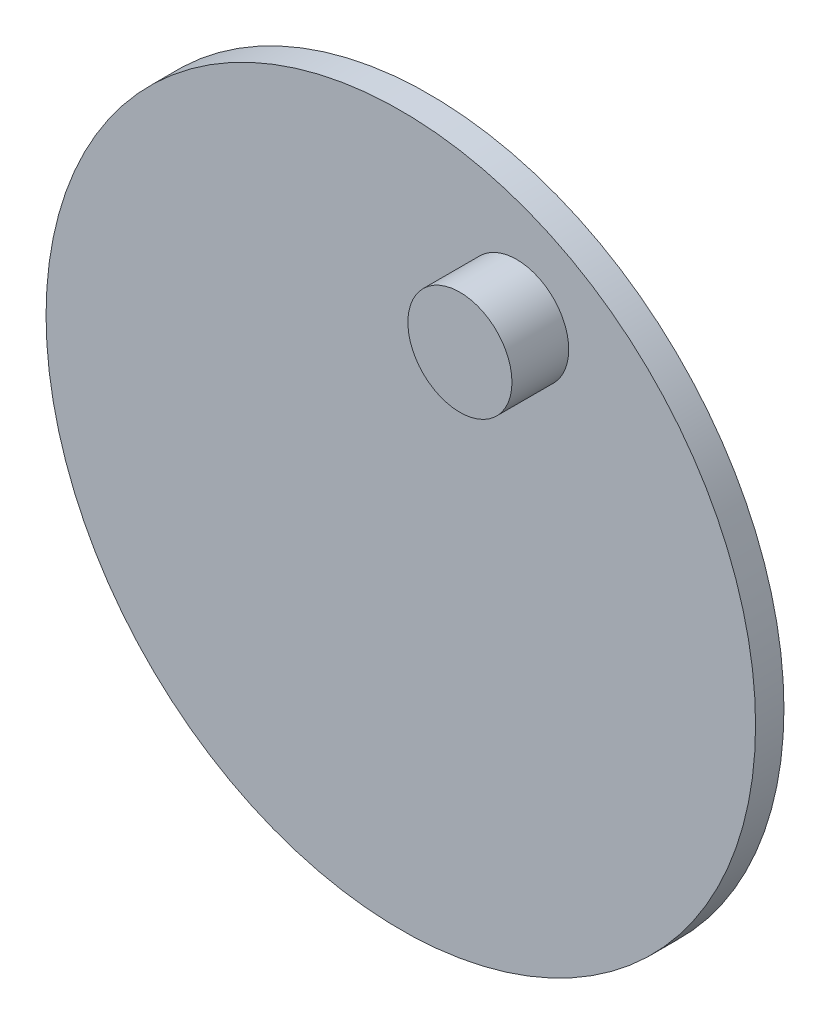
ISO-10303-21;
HEADER;
FILE_DESCRIPTION(('STEP AP214'),'2;1');
FILE_NAME('part.step','',(''),(''),'','','');
FILE_SCHEMA(('AUTOMOTIVE_DESIGN { 1 0 10303 214 1 1 1 1 }'));
ENDSEC;
DATA;
#1=APPLICATION_CONTEXT('core data for automotive mechanical design processes');
#2=APPLICATION_PROTOCOL_DEFINITION('international standard','automotive_design',2000,#1);
#3=PRODUCT_CONTEXT('',#1,'mechanical');
#4=PRODUCT('Part','Part','',(#3));
#5=PRODUCT_RELATED_PRODUCT_CATEGORY('part','',(#4));
#6=PRODUCT_DEFINITION_FORMATION('','',#4);
#7=PRODUCT_DEFINITION_CONTEXT('part definition',#1,'design');
#8=PRODUCT_DEFINITION('design','',#6,#7);
#9=PRODUCT_DEFINITION_SHAPE('','',#8);
#10=(LENGTH_UNIT() NAMED_UNIT(*) SI_UNIT(.MILLI.,.METRE.));
#11=(NAMED_UNIT(*) PLANE_ANGLE_UNIT() SI_UNIT($,.RADIAN.));
#12=(NAMED_UNIT(*) SI_UNIT($,.STERADIAN.) SOLID_ANGLE_UNIT());
#13=UNCERTAINTY_MEASURE_WITH_UNIT(LENGTH_MEASURE(1.E-05),#10,'distance_accuracy_value','');
#14=(GEOMETRIC_REPRESENTATION_CONTEXT(3) GLOBAL_UNCERTAINTY_ASSIGNED_CONTEXT((#13)) GLOBAL_UNIT_ASSIGNED_CONTEXT((#10,
#11,#12)) REPRESENTATION_CONTEXT('',''));
#15=CARTESIAN_POINT('',(0.,0.,0.));
#16=DIRECTION('',(0.,0.,1.));
#17=DIRECTION('',(1.,0.,0.));
#18=AXIS2_PLACEMENT_3D('',#15,#16,#17);
#19=CARTESIAN_POINT('',(0.,0.,6.));
#20=DIRECTION('',(0.,0.,-1.));
#21=DIRECTION('',(-1.,0.,0.));
#22=AXIS2_PLACEMENT_3D('',#19,#20,#21);
#23=CYLINDRICAL_SURFACE('',#22,75.);
#24=CARTESIAN_POINT('',(0.,0.,6.));
#25=DIRECTION('',(0.,0.,1.));
#26=DIRECTION('',(1.,0.,0.));
#27=AXIS2_PLACEMENT_3D('',#24,#25,#26);
#28=CIRCLE('',#27,75.);
#29=CARTESIAN_POINT('',(75.,0.,6.));
#30=VERTEX_POINT('',#29);
#31=EDGE_CURVE('E10',#30,#30,#28,.T.);
#32=ORIENTED_EDGE('',*,*,#31,.F.);
#33=EDGE_LOOP('',(#32));
#34=FACE_BOUND('',#33,.T.);
#35=CARTESIAN_POINT('',(0.,0.,0.));
#36=DIRECTION('',(0.,0.,1.));
#37=DIRECTION('',(1.,0.,0.));
#38=AXIS2_PLACEMENT_3D('',#35,#36,#37);
#39=CIRCLE('',#38,75.);
#40=CARTESIAN_POINT('',(75.,0.,0.));
#41=VERTEX_POINT('',#40);
#42=EDGE_CURVE('E36',#41,#41,#39,.T.);
#43=ORIENTED_EDGE('',*,*,#42,.T.);
#44=EDGE_LOOP('',(#43));
#45=FACE_BOUND('',#44,.T.);
#46=ADVANCED_FACE('F33',(#34,#45),#23,.T.);
#47=CARTESIAN_POINT('',(0.,0.,6.));
#48=DIRECTION('',(0.,0.,1.));
#49=DIRECTION('',(1.,0.,0.));
#50=AXIS2_PLACEMENT_3D('',#47,#48,#49);
#51=PLANE('',#50);
#52=CARTESIAN_POINT('',(24.4953174038477,48.9906348076955,6.));
#53=DIRECTION('',(0.,0.,1.));
#54=DIRECTION('',(1.,0.,0.));
#55=AXIS2_PLACEMENT_3D('',#52,#53,#54);
#56=CIRCLE('',#55,11.);
#57=CARTESIAN_POINT('',(35.4953174038477,48.9906348076955,6.));
#58=VERTEX_POINT('',#57);
#59=EDGE_CURVE('E45',#58,#58,#56,.T.);
#60=ORIENTED_EDGE('',*,*,#59,.F.);
#61=EDGE_LOOP('',(#60));
#62=FACE_BOUND('',#61,.T.);
#63=ORIENTED_EDGE('',*,*,#31,.T.);
#64=EDGE_LOOP('',(#63));
#65=FACE_BOUND('',#64,.T.);
#66=ADVANCED_FACE('F60',(#62,#65),#51,.T.);
#67=CARTESIAN_POINT('',(0.,0.,0.));
#68=DIRECTION('',(0.,0.,1.));
#69=DIRECTION('',(1.,0.,0.));
#70=AXIS2_PLACEMENT_3D('',#67,#68,#69);
#71=PLANE('',#70);
#72=ORIENTED_EDGE('',*,*,#42,.F.);
#73=EDGE_LOOP('',(#72));
#74=FACE_BOUND('',#73,.T.);
#75=ADVANCED_FACE('F56',(#74),#71,.F.);
#76=CARTESIAN_POINT('',(24.4953174038477,48.9906348076955,18.));
#77=DIRECTION('',(0.,0.,-1.));
#78=DIRECTION('',(-1.,0.,0.));
#79=AXIS2_PLACEMENT_3D('',#76,#77,#78);
#80=CYLINDRICAL_SURFACE('',#79,11.);
#81=CARTESIAN_POINT('',(24.4953174038477,48.9906348076955,18.));
#82=DIRECTION('',(0.,0.,1.));
#83=DIRECTION('',(1.,0.,0.));
#84=AXIS2_PLACEMENT_3D('',#81,#82,#83);
#85=CIRCLE('',#84,11.);
#86=CARTESIAN_POINT('',(35.4953174038477,48.9906348076955,18.));
#87=VERTEX_POINT('',#86);
#88=EDGE_CURVE('E43',#87,#87,#85,.T.);
#89=ORIENTED_EDGE('',*,*,#88,.F.);
#90=EDGE_LOOP('',(#89));
#91=FACE_BOUND('',#90,.T.);
#92=ORIENTED_EDGE('',*,*,#59,.T.);
#93=EDGE_LOOP('',(#92));
#94=FACE_BOUND('',#93,.T.);
#95=ADVANCED_FACE('F53',(#91,#94),#80,.T.);
#96=CARTESIAN_POINT('',(24.4953174038477,48.9906348076955,18.));
#97=DIRECTION('',(0.,0.,1.));
#98=DIRECTION('',(1.,0.,0.));
#99=AXIS2_PLACEMENT_3D('',#96,#97,#98);
#100=PLANE('',#99);
#101=ORIENTED_EDGE('',*,*,#88,.T.);
#102=EDGE_LOOP('',(#101));
#103=FACE_BOUND('',#102,.T.);
#104=ADVANCED_FACE('F51',(#103),#100,.T.);
#105=CLOSED_SHELL('',(#46,#66,#75,#95,#104));
#106=MANIFOLD_SOLID_BREP('B2',#105);
#107=ADVANCED_BREP_SHAPE_REPRESENTATION('',(#18,#106),#14);
#108=SHAPE_DEFINITION_REPRESENTATION(#9,#107);
ENDSEC;
END-ISO-10303-21;
